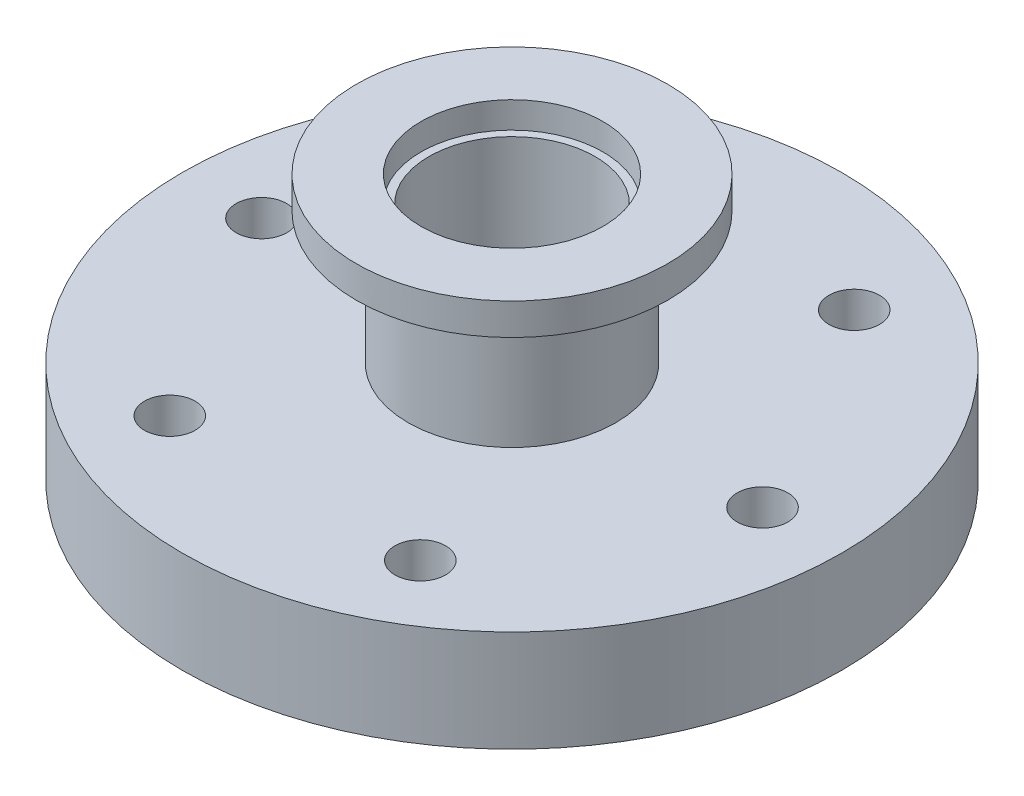
ISO-10303-21;
HEADER;
FILE_DESCRIPTION(('STEP AP214'),'2;1');
FILE_NAME('part.step','',(''),(''),'','','');
FILE_SCHEMA(('AUTOMOTIVE_DESIGN { 1 0 10303 214 1 1 1 1 }'));
ENDSEC;
DATA;
#1=APPLICATION_CONTEXT('core data for automotive mechanical design processes');
#2=APPLICATION_PROTOCOL_DEFINITION('international standard','automotive_design',2000,#1);
#3=PRODUCT_CONTEXT('',#1,'mechanical');
#4=PRODUCT('Part','Part','',(#3));
#5=PRODUCT_RELATED_PRODUCT_CATEGORY('part','',(#4));
#6=PRODUCT_DEFINITION_FORMATION('','',#4);
#7=PRODUCT_DEFINITION_CONTEXT('part definition',#1,'design');
#8=PRODUCT_DEFINITION('design','',#6,#7);
#9=PRODUCT_DEFINITION_SHAPE('','',#8);
#10=(LENGTH_UNIT() NAMED_UNIT(*) SI_UNIT(.MILLI.,.METRE.));
#11=(NAMED_UNIT(*) PLANE_ANGLE_UNIT() SI_UNIT($,.RADIAN.));
#12=(NAMED_UNIT(*) SI_UNIT($,.STERADIAN.) SOLID_ANGLE_UNIT());
#13=UNCERTAINTY_MEASURE_WITH_UNIT(LENGTH_MEASURE(1.E-05),#10,'distance_accuracy_value','');
#14=(GEOMETRIC_REPRESENTATION_CONTEXT(3) GLOBAL_UNCERTAINTY_ASSIGNED_CONTEXT((#13)) GLOBAL_UNIT_ASSIGNED_CONTEXT((#10,
#11,#12)) REPRESENTATION_CONTEXT('',''));
#15=CARTESIAN_POINT('',(0.,0.,0.));
#16=DIRECTION('',(0.,0.,1.));
#17=DIRECTION('',(1.,0.,0.));
#18=AXIS2_PLACEMENT_3D('',#15,#16,#17);
#19=CARTESIAN_POINT('',(0.,22.479,0.));
#20=DIRECTION('',(0.,-1.,0.));
#21=DIRECTION('',(0.,0.,-1.));
#22=AXIS2_PLACEMENT_3D('',#19,#20,#21);
#23=CYLINDRICAL_SURFACE('',#22,10.);
#24=CARTESIAN_POINT('',(0.,9.779,0.));
#25=DIRECTION('',(0.,1.,0.));
#26=DIRECTION('',(0.,0.,1.));
#27=AXIS2_PLACEMENT_3D('',#24,#25,#26);
#28=CIRCLE('',#27,10.);
#29=CARTESIAN_POINT('',(0.,9.779,10.));
#30=VERTEX_POINT('',#29);
#31=EDGE_CURVE('E122',#30,#30,#28,.T.);
#32=ORIENTED_EDGE('',*,*,#31,.T.);
#33=EDGE_LOOP('',(#32));
#34=FACE_BOUND('',#33,.T.);
#35=CARTESIAN_POINT('',(0.,21.1430053265385,0.));
#36=DIRECTION('',(0.,1.,0.));
#37=DIRECTION('',(0.,0.,1.));
#38=AXIS2_PLACEMENT_3D('',#35,#36,#37);
#39=CIRCLE('',#38,10.);
#40=CARTESIAN_POINT('',(0.,21.1430053265385,10.));
#41=VERTEX_POINT('',#40);
#42=EDGE_CURVE('E10',#41,#41,#39,.T.);
#43=ORIENTED_EDGE('',*,*,#42,.F.);
#44=EDGE_LOOP('',(#43));
#45=FACE_BOUND('',#44,.T.);
#46=ADVANCED_FACE('F41',(#34,#45),#23,.T.);
#47=CARTESIAN_POINT('',(0.,9.779,0.));
#48=DIRECTION('',(0.,-1.,0.));
#49=DIRECTION('',(0.,0.,-1.));
#50=AXIS2_PLACEMENT_3D('',#47,#48,#49);
#51=CYLINDRICAL_SURFACE('',#50,31.75);
#52=CARTESIAN_POINT('',(0.,9.779,0.));
#53=DIRECTION('',(0.,1.,0.));
#54=DIRECTION('',(0.,0.,1.));
#55=AXIS2_PLACEMENT_3D('',#52,#53,#54);
#56=CIRCLE('',#55,31.75);
#57=CARTESIAN_POINT('',(0.,9.779,31.75));
#58=VERTEX_POINT('',#57);
#59=EDGE_CURVE('E49',#58,#58,#56,.T.);
#60=ORIENTED_EDGE('',*,*,#59,.F.);
#61=EDGE_LOOP('',(#60));
#62=FACE_BOUND('',#61,.T.);
#63=CARTESIAN_POINT('',(0.,0.,0.));
#64=DIRECTION('',(0.,1.,0.));
#65=DIRECTION('',(0.,0.,1.));
#66=AXIS2_PLACEMENT_3D('',#63,#64,#65);
#67=CIRCLE('',#66,31.75);
#68=CARTESIAN_POINT('',(0.,0.,31.75));
#69=VERTEX_POINT('',#68);
#70=EDGE_CURVE('E54',#69,#69,#67,.T.);
#71=ORIENTED_EDGE('',*,*,#70,.T.);
#72=EDGE_LOOP('',(#71));
#73=FACE_BOUND('',#72,.T.);
#74=ADVANCED_FACE('F43',(#62,#73),#51,.T.);
#75=CARTESIAN_POINT('',(0.,9.779,0.));
#76=DIRECTION('',(0.,1.,0.));
#77=DIRECTION('',(0.,0.,1.));
#78=AXIS2_PLACEMENT_3D('',#75,#76,#77);
#79=PLANE('',#78);
#80=ORIENTED_EDGE('',*,*,#31,.F.);
#81=EDGE_LOOP('',(#80));
#82=FACE_BOUND('',#81,.T.);
#83=CARTESIAN_POINT('',(-12.0625000000002,9.779,20.8928628662994));
#84=DIRECTION('',(0.,1.,0.));
#85=DIRECTION('',(0.866025403784433,0.,0.50000000000001));
#86=AXIS2_PLACEMENT_3D('',#83,#84,#85);
#87=CIRCLE('',#86,2.4384);
#88=CARTESIAN_POINT('',(-9.95078365541228,9.779,22.1120628662995));
#89=VERTEX_POINT('',#88);
#90=EDGE_CURVE('E78',#89,#89,#87,.T.);
#91=ORIENTED_EDGE('',*,*,#90,.F.);
#92=EDGE_LOOP('',(#91));
#93=FACE_BOUND('',#92,.T.);
#94=CARTESIAN_POINT('',(12.0624999999998,9.779,20.8928628662997));
#95=DIRECTION('',(0.,1.,0.));
#96=DIRECTION('',(0.866025403784443,0.,-0.499999999999992));
#97=AXIS2_PLACEMENT_3D('',#94,#95,#96);
#98=CIRCLE('',#97,2.4384);
#99=CARTESIAN_POINT('',(14.1742163445878,9.779,19.6736628662997));
#100=VERTEX_POINT('',#99);
#101=EDGE_CURVE('E87',#100,#100,#98,.T.);
#102=ORIENTED_EDGE('',*,*,#101,.F.);
#103=EDGE_LOOP('',(#102));
#104=FACE_BOUND('',#103,.T.);
#105=CARTESIAN_POINT('',(24.125,9.779,0.));
#106=DIRECTION('',(0.,1.,0.));
#107=DIRECTION('',(0.,0.,-1.));
#108=AXIS2_PLACEMENT_3D('',#105,#106,#107);
#109=CIRCLE('',#108,2.4384);
#110=CARTESIAN_POINT('',(24.125,9.779,-2.4384));
#111=VERTEX_POINT('',#110);
#112=EDGE_CURVE('E95',#111,#111,#109,.T.);
#113=ORIENTED_EDGE('',*,*,#112,.F.);
#114=EDGE_LOOP('',(#113));
#115=FACE_BOUND('',#114,.T.);
#116=CARTESIAN_POINT('',(12.0625000000001,9.779,-20.8928628662995));
#117=DIRECTION('',(0.,1.,0.));
#118=DIRECTION('',(-0.866025403784436,0.,-0.500000000000004));
#119=AXIS2_PLACEMENT_3D('',#116,#117,#118);
#120=CIRCLE('',#119,2.4384);
#121=CARTESIAN_POINT('',(9.95078365541213,9.779,-22.1120628662995));
#122=VERTEX_POINT('',#121);
#123=EDGE_CURVE('E103',#122,#122,#120,.T.);
#124=ORIENTED_EDGE('',*,*,#123,.F.);
#125=EDGE_LOOP('',(#124));
#126=FACE_BOUND('',#125,.T.);
#127=CARTESIAN_POINT('',(-12.0625,9.779,-20.8928628662996));
#128=DIRECTION('',(0.,1.,0.));
#129=DIRECTION('',(-0.86602540378444,0.,0.499999999999998));
#130=AXIS2_PLACEMENT_3D('',#127,#128,#129);
#131=CIRCLE('',#130,2.4384);
#132=CARTESIAN_POINT('',(-14.1742163445879,9.779,-19.6736628662996));
#133=VERTEX_POINT('',#132);
#134=EDGE_CURVE('E70',#133,#133,#131,.T.);
#135=ORIENTED_EDGE('',*,*,#134,.F.);
#136=EDGE_LOOP('',(#135));
#137=FACE_BOUND('',#136,.T.);
#138=CARTESIAN_POINT('',(-24.125,9.779,0.));
#139=DIRECTION('',(0.,1.,0.));
#140=DIRECTION('',(0.,0.,1.));
#141=AXIS2_PLACEMENT_3D('',#138,#139,#140);
#142=CIRCLE('',#141,2.4384);
#143=CARTESIAN_POINT('',(-24.125,9.779,2.4384));
#144=VERTEX_POINT('',#143);
#145=EDGE_CURVE('E62',#144,#144,#142,.T.);
#146=ORIENTED_EDGE('',*,*,#145,.F.);
#147=EDGE_LOOP('',(#146));
#148=FACE_BOUND('',#147,.T.);
#149=ORIENTED_EDGE('',*,*,#59,.T.);
#150=EDGE_LOOP('',(#149));
#151=FACE_BOUND('',#150,.T.);
#152=ADVANCED_FACE('F174',(#82,#93,#104,#115,#126,#137,#148,#151),#79,.T.);
#153=CARTESIAN_POINT('',(0.,0.,0.));
#154=DIRECTION('',(0.,1.,0.));
#155=DIRECTION('',(0.,0.,1.));
#156=AXIS2_PLACEMENT_3D('',#153,#154,#155);
#157=PLANE('',#156);
#158=CARTESIAN_POINT('',(0.,0.,0.));
#159=DIRECTION('',(0.,-1.,0.));
#160=DIRECTION('',(0.,0.,-1.));
#161=AXIS2_PLACEMENT_3D('',#158,#159,#160);
#162=CIRCLE('',#161,20.955);
#163=CARTESIAN_POINT('',(0.,0.,-20.955));
#164=VERTEX_POINT('',#163);
#165=EDGE_CURVE('E110',#164,#164,#162,.T.);
#166=ORIENTED_EDGE('',*,*,#165,.F.);
#167=EDGE_LOOP('',(#166));
#168=FACE_BOUND('',#167,.T.);
#169=CARTESIAN_POINT('',(-12.0625000000002,0.,20.8928628662994));
#170=DIRECTION('',(0.,1.,0.));
#171=DIRECTION('',(0.866025403784433,0.,0.50000000000001));
#172=AXIS2_PLACEMENT_3D('',#169,#170,#171);
#173=CIRCLE('',#172,2.4384);
#174=CARTESIAN_POINT('',(-9.95078365541228,0.,22.1120628662995));
#175=VERTEX_POINT('',#174);
#176=EDGE_CURVE('E82',#175,#175,#173,.T.);
#177=ORIENTED_EDGE('',*,*,#176,.T.);
#178=EDGE_LOOP('',(#177));
#179=FACE_BOUND('',#178,.T.);
#180=CARTESIAN_POINT('',(12.0624999999998,0.,20.8928628662997));
#181=DIRECTION('',(0.,1.,0.));
#182=DIRECTION('',(0.866025403784443,0.,-0.499999999999992));
#183=AXIS2_PLACEMENT_3D('',#180,#181,#182);
#184=CIRCLE('',#183,2.4384);
#185=CARTESIAN_POINT('',(14.1742163445878,0.,19.6736628662997));
#186=VERTEX_POINT('',#185);
#187=EDGE_CURVE('E91',#186,#186,#184,.T.);
#188=ORIENTED_EDGE('',*,*,#187,.T.);
#189=EDGE_LOOP('',(#188));
#190=FACE_BOUND('',#189,.T.);
#191=CARTESIAN_POINT('',(24.125,0.,0.));
#192=DIRECTION('',(0.,1.,0.));
#193=DIRECTION('',(0.,0.,-1.));
#194=AXIS2_PLACEMENT_3D('',#191,#192,#193);
#195=CIRCLE('',#194,2.4384);
#196=CARTESIAN_POINT('',(24.125,0.,-2.4384));
#197=VERTEX_POINT('',#196);
#198=EDGE_CURVE('E99',#197,#197,#195,.T.);
#199=ORIENTED_EDGE('',*,*,#198,.T.);
#200=EDGE_LOOP('',(#199));
#201=FACE_BOUND('',#200,.T.);
#202=CARTESIAN_POINT('',(12.0625000000001,0.,-20.8928628662995));
#203=DIRECTION('',(0.,1.,0.));
#204=DIRECTION('',(-0.866025403784436,0.,-0.500000000000004));
#205=AXIS2_PLACEMENT_3D('',#202,#203,#204);
#206=CIRCLE('',#205,2.4384);
#207=CARTESIAN_POINT('',(9.95078365541213,0.,-22.1120628662995));
#208=VERTEX_POINT('',#207);
#209=EDGE_CURVE('E74',#208,#208,#206,.T.);
#210=ORIENTED_EDGE('',*,*,#209,.T.);
#211=EDGE_LOOP('',(#210));
#212=FACE_BOUND('',#211,.T.);
#213=CARTESIAN_POINT('',(-12.0625,0.,-20.8928628662996));
#214=DIRECTION('',(0.,1.,0.));
#215=DIRECTION('',(-0.86602540378444,0.,0.499999999999998));
#216=AXIS2_PLACEMENT_3D('',#213,#214,#215);
#217=CIRCLE('',#216,2.4384);
#218=CARTESIAN_POINT('',(-14.1742163445879,0.,-19.6736628662996));
#219=VERTEX_POINT('',#218);
#220=EDGE_CURVE('E66',#219,#219,#217,.T.);
#221=ORIENTED_EDGE('',*,*,#220,.T.);
#222=EDGE_LOOP('',(#221));
#223=FACE_BOUND('',#222,.T.);
#224=CARTESIAN_POINT('',(-24.125,0.,0.));
#225=DIRECTION('',(0.,1.,0.));
#226=DIRECTION('',(0.,0.,1.));
#227=AXIS2_PLACEMENT_3D('',#224,#225,#226);
#228=CIRCLE('',#227,2.4384);
#229=CARTESIAN_POINT('',(-24.125,0.,2.4384));
#230=VERTEX_POINT('',#229);
#231=EDGE_CURVE('E60',#230,#230,#228,.T.);
#232=ORIENTED_EDGE('',*,*,#231,.T.);
#233=EDGE_LOOP('',(#232));
#234=FACE_BOUND('',#233,.T.);
#235=ORIENTED_EDGE('',*,*,#70,.F.);
#236=EDGE_LOOP('',(#235));
#237=FACE_BOUND('',#236,.T.);
#238=ADVANCED_FACE('F213',(#168,#179,#190,#201,#212,#223,#234,#237),#157,.F.);
#239=CARTESIAN_POINT('',(-24.125,0.,0.));
#240=DIRECTION('',(0.,1.,0.));
#241=DIRECTION('',(0.,0.,1.));
#242=AXIS2_PLACEMENT_3D('',#239,#240,#241);
#243=CYLINDRICAL_SURFACE('',#242,2.4384);
#244=ORIENTED_EDGE('',*,*,#231,.F.);
#245=EDGE_LOOP('',(#244));
#246=FACE_BOUND('',#245,.T.);
#247=ORIENTED_EDGE('',*,*,#145,.T.);
#248=EDGE_LOOP('',(#247));
#249=FACE_BOUND('',#248,.T.);
#250=ADVANCED_FACE('F209',(#246,#249),#243,.F.);
#251=CARTESIAN_POINT('',(-12.0625,0.,-20.8928628662996));
#252=DIRECTION('',(0.,1.,0.));
#253=DIRECTION('',(0.,0.,1.));
#254=AXIS2_PLACEMENT_3D('',#251,#252,#253);
#255=CYLINDRICAL_SURFACE('',#254,2.4384);
#256=ORIENTED_EDGE('',*,*,#220,.F.);
#257=EDGE_LOOP('',(#256));
#258=FACE_BOUND('',#257,.T.);
#259=ORIENTED_EDGE('',*,*,#134,.T.);
#260=EDGE_LOOP('',(#259));
#261=FACE_BOUND('',#260,.T.);
#262=ADVANCED_FACE('F195',(#258,#261),#255,.F.);
#263=CARTESIAN_POINT('',(12.0625000000001,0.,-20.8928628662995));
#264=DIRECTION('',(0.,1.,0.));
#265=DIRECTION('',(0.,0.,1.));
#266=AXIS2_PLACEMENT_3D('',#263,#264,#265);
#267=CYLINDRICAL_SURFACE('',#266,2.4384);
#268=ORIENTED_EDGE('',*,*,#209,.F.);
#269=EDGE_LOOP('',(#268));
#270=FACE_BOUND('',#269,.T.);
#271=ORIENTED_EDGE('',*,*,#123,.T.);
#272=EDGE_LOOP('',(#271));
#273=FACE_BOUND('',#272,.T.);
#274=ADVANCED_FACE('F191',(#270,#273),#267,.F.);
#275=CARTESIAN_POINT('',(24.125,0.,0.));
#276=DIRECTION('',(0.,1.,0.));
#277=DIRECTION('',(0.,0.,1.));
#278=AXIS2_PLACEMENT_3D('',#275,#276,#277);
#279=CYLINDRICAL_SURFACE('',#278,2.4384);
#280=ORIENTED_EDGE('',*,*,#198,.F.);
#281=EDGE_LOOP('',(#280));
#282=FACE_BOUND('',#281,.T.);
#283=ORIENTED_EDGE('',*,*,#112,.T.);
#284=EDGE_LOOP('',(#283));
#285=FACE_BOUND('',#284,.T.);
#286=ADVANCED_FACE('F194',(#282,#285),#279,.F.);
#287=CARTESIAN_POINT('',(12.0624999999998,0.,20.8928628662997));
#288=DIRECTION('',(0.,1.,0.));
#289=DIRECTION('',(0.,0.,1.));
#290=AXIS2_PLACEMENT_3D('',#287,#288,#289);
#291=CYLINDRICAL_SURFACE('',#290,2.4384);
#292=ORIENTED_EDGE('',*,*,#187,.F.);
#293=EDGE_LOOP('',(#292));
#294=FACE_BOUND('',#293,.T.);
#295=ORIENTED_EDGE('',*,*,#101,.T.);
#296=EDGE_LOOP('',(#295));
#297=FACE_BOUND('',#296,.T.);
#298=ADVANCED_FACE('F199',(#294,#297),#291,.F.);
#299=CARTESIAN_POINT('',(-12.0625000000002,0.,20.8928628662994));
#300=DIRECTION('',(0.,1.,0.));
#301=DIRECTION('',(0.,0.,1.));
#302=AXIS2_PLACEMENT_3D('',#299,#300,#301);
#303=CYLINDRICAL_SURFACE('',#302,2.4384);
#304=ORIENTED_EDGE('',*,*,#176,.F.);
#305=EDGE_LOOP('',(#304));
#306=FACE_BOUND('',#305,.T.);
#307=ORIENTED_EDGE('',*,*,#90,.T.);
#308=EDGE_LOOP('',(#307));
#309=FACE_BOUND('',#308,.T.);
#310=ADVANCED_FACE('F189',(#306,#309),#303,.F.);
#311=CARTESIAN_POINT('',(0.,2.,0.));
#312=DIRECTION('',(0.,-1.,0.));
#313=DIRECTION('',(0.,0.,-1.));
#314=AXIS2_PLACEMENT_3D('',#311,#312,#313);
#315=CYLINDRICAL_SURFACE('',#314,20.955);
#316=CARTESIAN_POINT('',(0.,2.,0.));
#317=DIRECTION('',(0.,-1.,0.));
#318=DIRECTION('',(0.,0.,-1.));
#319=AXIS2_PLACEMENT_3D('',#316,#317,#318);
#320=CIRCLE('',#319,20.955);
#321=CARTESIAN_POINT('',(0.,2.,-20.955));
#322=VERTEX_POINT('',#321);
#323=EDGE_CURVE('E83',#322,#322,#320,.T.);
#324=ORIENTED_EDGE('',*,*,#323,.F.);
#325=EDGE_LOOP('',(#324));
#326=FACE_BOUND('',#325,.T.);
#327=ORIENTED_EDGE('',*,*,#165,.T.);
#328=EDGE_LOOP('',(#327));
#329=FACE_BOUND('',#328,.T.);
#330=ADVANCED_FACE('F185',(#326,#329),#315,.F.);
#331=CARTESIAN_POINT('',(0.,2.,0.));
#332=DIRECTION('',(0.,-1.,0.));
#333=DIRECTION('',(0.,0.,-1.));
#334=AXIS2_PLACEMENT_3D('',#331,#332,#333);
#335=PLANE('',#334);
#336=CARTESIAN_POINT('',(0.,2.,0.));
#337=DIRECTION('',(0.,-1.,0.));
#338=DIRECTION('',(0.,0.,-1.));
#339=AXIS2_PLACEMENT_3D('',#336,#337,#338);
#340=CIRCLE('',#339,17.8435);
#341=CARTESIAN_POINT('',(0.,2.,-17.8435));
#342=VERTEX_POINT('',#341);
#343=EDGE_CURVE('E114',#342,#342,#340,.T.);
#344=ORIENTED_EDGE('',*,*,#343,.F.);
#345=EDGE_LOOP('',(#344));
#346=FACE_BOUND('',#345,.T.);
#347=ORIENTED_EDGE('',*,*,#323,.T.);
#348=EDGE_LOOP('',(#347));
#349=FACE_BOUND('',#348,.T.);
#350=ADVANCED_FACE('F181',(#346,#349),#335,.T.);
#351=CARTESIAN_POINT('',(0.,2.,0.));
#352=DIRECTION('',(0.,-1.,0.));
#353=DIRECTION('',(0.,0.,-1.));
#354=AXIS2_PLACEMENT_3D('',#351,#352,#353);
#355=CYLINDRICAL_SURFACE('',#354,17.8435);
#356=ORIENTED_EDGE('',*,*,#343,.T.);
#357=EDGE_LOOP('',(#356));
#358=FACE_BOUND('',#357,.T.);
#359=CARTESIAN_POINT('',(0.,0.,0.));
#360=DIRECTION('',(0.,-1.,0.));
#361=DIRECTION('',(0.,0.,-1.));
#362=AXIS2_PLACEMENT_3D('',#359,#360,#361);
#363=CIRCLE('',#362,17.8435);
#364=CARTESIAN_POINT('',(0.,0.,-17.8435));
#365=VERTEX_POINT('',#364);
#366=EDGE_CURVE('E118',#365,#365,#363,.T.);
#367=ORIENTED_EDGE('',*,*,#366,.F.);
#368=EDGE_LOOP('',(#367));
#369=FACE_BOUND('',#368,.T.);
#370=ADVANCED_FACE('F178',(#358,#369),#355,.T.);
#371=CARTESIAN_POINT('',(0.,0.,0.));
#372=DIRECTION('',(0.,1.,0.));
#373=DIRECTION('',(0.,0.,1.));
#374=AXIS2_PLACEMENT_3D('',#371,#372,#373);
#375=CIRCLE('',#374,8.);
#376=CARTESIAN_POINT('',(0.,0.,8.));
#377=VERTEX_POINT('',#376);
#378=EDGE_CURVE('E145',#377,#377,#375,.T.);
#379=ORIENTED_EDGE('',*,*,#378,.T.);
#380=EDGE_LOOP('',(#379));
#381=FACE_BOUND('',#380,.T.);
#382=ORIENTED_EDGE('',*,*,#366,.T.);
#383=EDGE_LOOP('',(#382));
#384=FACE_BOUND('',#383,.T.);
#385=ADVANCED_FACE('F154',(#381,#384),#157,.F.);
#386=CARTESIAN_POINT('',(0.,22.479,0.));
#387=DIRECTION('',(0.,1.,0.));
#388=DIRECTION('',(0.,0.,1.));
#389=AXIS2_PLACEMENT_3D('',#386,#387,#388);
#390=CONICAL_SURFACE('',#389,14.986,1.30899693899575);
#391=ORIENTED_EDGE('',*,*,#42,.T.);
#392=EDGE_LOOP('',(#391));
#393=FACE_BOUND('',#392,.T.);
#394=CARTESIAN_POINT('',(0.,22.479,0.));
#395=DIRECTION('',(0.,-1.,0.));
#396=DIRECTION('',(0.,0.,-1.));
#397=AXIS2_PLACEMENT_3D('',#394,#395,#396);
#398=CIRCLE('',#397,14.986);
#399=CARTESIAN_POINT('',(0.,22.479,-14.986));
#400=VERTEX_POINT('',#399);
#401=EDGE_CURVE('E138',#400,#400,#398,.T.);
#402=ORIENTED_EDGE('',*,*,#401,.T.);
#403=EDGE_LOOP('',(#402));
#404=FACE_BOUND('',#403,.T.);
#405=ADVANCED_FACE('F224',(#393,#404),#390,.T.);
#406=CARTESIAN_POINT('',(0.,22.987,0.));
#407=DIRECTION('',(0.,1.,0.));
#408=DIRECTION('',(0.,0.,1.));
#409=AXIS2_PLACEMENT_3D('',#406,#407,#408);
#410=PLANE('',#409);
#411=CARTESIAN_POINT('',(0.,22.987,0.));
#412=DIRECTION('',(0.,1.,0.));
#413=DIRECTION('',(0.,0.,1.));
#414=AXIS2_PLACEMENT_3D('',#411,#412,#413);
#415=CIRCLE('',#414,8.);
#416=CARTESIAN_POINT('',(0.,22.987,8.));
#417=VERTEX_POINT('',#416);
#418=EDGE_CURVE('E146',#417,#417,#415,.T.);
#419=ORIENTED_EDGE('',*,*,#418,.F.);
#420=EDGE_LOOP('',(#419));
#421=FACE_BOUND('',#420,.T.);
#422=CARTESIAN_POINT('',(0.,22.987,0.));
#423=DIRECTION('',(0.,1.,0.));
#424=DIRECTION('',(0.,0.,1.));
#425=AXIS2_PLACEMENT_3D('',#422,#423,#424);
#426=CIRCLE('',#425,8.763);
#427=CARTESIAN_POINT('',(0.,22.987,8.763));
#428=VERTEX_POINT('',#427);
#429=EDGE_CURVE('E133',#428,#428,#426,.T.);
#430=ORIENTED_EDGE('',*,*,#429,.T.);
#431=EDGE_LOOP('',(#430));
#432=FACE_BOUND('',#431,.T.);
#433=ADVANCED_FACE('F228',(#421,#432),#410,.T.);
#434=CARTESIAN_POINT('',(0.,22.987,0.));
#435=DIRECTION('',(0.,1.,0.));
#436=DIRECTION('',(0.,0.,1.));
#437=AXIS2_PLACEMENT_3D('',#434,#435,#436);
#438=CYLINDRICAL_SURFACE('',#437,8.763);
#439=ORIENTED_EDGE('',*,*,#429,.F.);
#440=EDGE_LOOP('',(#439));
#441=FACE_BOUND('',#440,.T.);
#442=CARTESIAN_POINT('',(0.,25.527,0.));
#443=DIRECTION('',(0.,1.,0.));
#444=DIRECTION('',(0.,0.,1.));
#445=AXIS2_PLACEMENT_3D('',#442,#443,#444);
#446=CIRCLE('',#445,8.763);
#447=CARTESIAN_POINT('',(0.,25.527,8.763));
#448=VERTEX_POINT('',#447);
#449=EDGE_CURVE('E134',#448,#448,#446,.T.);
#450=ORIENTED_EDGE('',*,*,#449,.T.);
#451=EDGE_LOOP('',(#450));
#452=FACE_BOUND('',#451,.T.);
#453=ADVANCED_FACE('F233',(#441,#452),#438,.F.);
#454=CARTESIAN_POINT('',(0.,25.527,0.));
#455=DIRECTION('',(0.,1.,0.));
#456=DIRECTION('',(0.,0.,1.));
#457=AXIS2_PLACEMENT_3D('',#454,#455,#456);
#458=PLANE('',#457);
#459=ORIENTED_EDGE('',*,*,#449,.F.);
#460=EDGE_LOOP('',(#459));
#461=FACE_BOUND('',#460,.T.);
#462=CARTESIAN_POINT('',(0.,25.527,0.));
#463=DIRECTION('',(0.,1.,0.));
#464=DIRECTION('',(0.,0.,1.));
#465=AXIS2_PLACEMENT_3D('',#462,#463,#464);
#466=CIRCLE('',#465,14.986);
#467=CARTESIAN_POINT('',(0.,25.527,-14.986));
#468=VERTEX_POINT('',#467);
#469=EDGE_CURVE('E129',#468,#468,#466,.T.);
#470=ORIENTED_EDGE('',*,*,#469,.T.);
#471=EDGE_LOOP('',(#470));
#472=FACE_BOUND('',#471,.T.);
#473=ADVANCED_FACE('F165',(#461,#472),#458,.T.);
#474=CARTESIAN_POINT('',(0.,25.527,0.));
#475=DIRECTION('',(0.,-1.,0.));
#476=DIRECTION('',(0.,0.,-1.));
#477=AXIS2_PLACEMENT_3D('',#474,#475,#476);
#478=CYLINDRICAL_SURFACE('',#477,14.986);
#479=CARTESIAN_POINT('',(0.,25.527,-14.986));
#480=CARTESIAN_POINT('',(0.,25.49525,-14.986));
#481=CARTESIAN_POINT('',(0.,25.4635,-14.986));
#482=CARTESIAN_POINT('',(0.,25.4,-14.986));
#483=CARTESIAN_POINT('',(0.,25.36825,-14.986));
#484=CARTESIAN_POINT('',(0.,25.30475,-14.986));
#485=CARTESIAN_POINT('',(0.,25.273,-14.986));
#486=CARTESIAN_POINT('',(0.,25.2095,-14.986));
#487=CARTESIAN_POINT('',(0.,25.17775,-14.986));
#488=CARTESIAN_POINT('',(0.,25.11425,-14.986));
#489=CARTESIAN_POINT('',(0.,25.0825,-14.986));
#490=CARTESIAN_POINT('',(0.,25.019,-14.986));
#491=CARTESIAN_POINT('',(0.,24.98725,-14.986));
#492=CARTESIAN_POINT('',(0.,24.92375,-14.986));
#493=CARTESIAN_POINT('',(0.,24.892,-14.986));
#494=CARTESIAN_POINT('',(0.,24.8285,-14.986));
#495=CARTESIAN_POINT('',(0.,24.79675,-14.986));
#496=CARTESIAN_POINT('',(0.,24.73325,-14.986));
#497=CARTESIAN_POINT('',(0.,24.7015,-14.986));
#498=CARTESIAN_POINT('',(0.,24.638,-14.986));
#499=CARTESIAN_POINT('',(0.,24.60625,-14.986));
#500=CARTESIAN_POINT('',(0.,24.54275,-14.986));
#501=CARTESIAN_POINT('',(0.,24.511,-14.986));
#502=CARTESIAN_POINT('',(0.,24.4475,-14.986));
#503=CARTESIAN_POINT('',(0.,24.41575,-14.986));
#504=CARTESIAN_POINT('',(0.,24.35225,-14.986));
#505=CARTESIAN_POINT('',(0.,24.3205,-14.986));
#506=CARTESIAN_POINT('',(0.,24.257,-14.986));
#507=CARTESIAN_POINT('',(0.,24.22525,-14.986));
#508=CARTESIAN_POINT('',(0.,24.16175,-14.986));
#509=CARTESIAN_POINT('',(0.,24.13,-14.986));
#510=CARTESIAN_POINT('',(0.,24.0665,-14.986));
#511=CARTESIAN_POINT('',(0.,24.03475,-14.986));
#512=CARTESIAN_POINT('',(0.,23.97125,-14.986));
#513=CARTESIAN_POINT('',(0.,23.9395,-14.986));
#514=CARTESIAN_POINT('',(0.,23.876,-14.986));
#515=CARTESIAN_POINT('',(0.,23.84425,-14.986));
#516=CARTESIAN_POINT('',(0.,23.78075,-14.986));
#517=CARTESIAN_POINT('',(0.,23.749,-14.986));
#518=CARTESIAN_POINT('',(0.,23.6855,-14.986));
#519=CARTESIAN_POINT('',(0.,23.65375,-14.986));
#520=CARTESIAN_POINT('',(0.,23.59025,-14.986));
#521=CARTESIAN_POINT('',(0.,23.5585,-14.986));
#522=CARTESIAN_POINT('',(0.,23.495,-14.986));
#523=CARTESIAN_POINT('',(0.,23.46325,-14.986));
#524=CARTESIAN_POINT('',(0.,23.39975,-14.986));
#525=CARTESIAN_POINT('',(0.,23.368,-14.986));
#526=CARTESIAN_POINT('',(0.,23.3045,-14.986));
#527=CARTESIAN_POINT('',(0.,23.27275,-14.986));
#528=CARTESIAN_POINT('',(0.,23.20925,-14.986));
#529=CARTESIAN_POINT('',(0.,23.1775,-14.986));
#530=CARTESIAN_POINT('',(0.,23.114,-14.986));
#531=CARTESIAN_POINT('',(0.,23.08225,-14.986));
#532=CARTESIAN_POINT('',(0.,23.01875,-14.986));
#533=CARTESIAN_POINT('',(0.,22.987,-14.986));
#534=CARTESIAN_POINT('',(0.,22.9235,-14.986));
#535=CARTESIAN_POINT('',(0.,22.89175,-14.986));
#536=CARTESIAN_POINT('',(0.,22.82825,-14.986));
#537=CARTESIAN_POINT('',(0.,22.7965,-14.986));
#538=CARTESIAN_POINT('',(0.,22.733,-14.986));
#539=CARTESIAN_POINT('',(0.,22.70125,-14.986));
#540=CARTESIAN_POINT('',(0.,22.63775,-14.986));
#541=CARTESIAN_POINT('',(0.,22.606,-14.986));
#542=CARTESIAN_POINT('',(0.,22.5425,-14.986));
#543=CARTESIAN_POINT('',(0.,22.51075,-14.986));
#544=CARTESIAN_POINT('',(0.,22.479,-14.986));
#545=B_SPLINE_CURVE_WITH_KNOTS('',3,(#479,#480,#481,#482,#483,#484,#485,#486,#487,#488,#489,
#490,#491,#492,#493,#494,#495,#496,#497,#498,#499,#500,#501,#502,#503,#504,#505,#506,#507,#508,
#509,#510,#511,#512,#513,#514,#515,#516,#517,#518,#519,#520,#521,#522,#523,#524,#525,#526,#527,
#528,#529,#530,#531,#532,#533,#534,#535,#536,#537,#538,#539,#540,#541,#542,#543,#544),
.UNSPECIFIED.,.F.,.F.,(4,2,2,2,2,2,2,2,2,2,2,2,2,2,2,2,2,2,2,2,2,2,2,2,2,2,2,2,2,2,2,2,4),(0.,
0.0952500000000016,0.1905,0.285750000000001,0.380999999999999,0.476250000000001,
0.571499999999999,0.666750000000001,0.761999999999999,0.85725,0.952499999999998,1.04775,1.143,
1.23825,1.3335,1.42875,1.524,1.61925,1.7145,1.80975,1.905,2.00025,2.0955,2.19075,2.286,2.38125,
2.4765,2.57175,2.667,2.76225,2.8575,2.95275,3.048),.UNSPECIFIED.);
#546=EDGE_CURVE('BSEAM159',#468,#400,#545,.T.);
#547=ORIENTED_EDGE('',*,*,#469,.F.);
#548=ORIENTED_EDGE('',*,*,#401,.F.);
#549=ORIENTED_EDGE('',*,*,#546,.T.);
#550=ORIENTED_EDGE('',*,*,#546,.F.);
#551=EDGE_LOOP('',(#547,#549,#548,#550));
#552=FACE_BOUND('',#551,.T.);
#553=ADVANCED_FACE('F159',(#552),#478,.T.);
#554=CARTESIAN_POINT('',(0.,22.479,0.));
#555=DIRECTION('',(0.,-1.,0.));
#556=DIRECTION('',(0.,0.,-1.));
#557=AXIS2_PLACEMENT_3D('',#554,#555,#556);
#558=CYLINDRICAL_SURFACE('',#557,8.);
#559=ORIENTED_EDGE('',*,*,#418,.T.);
#560=EDGE_LOOP('',(#559));
#561=FACE_BOUND('',#560,.T.);
#562=ORIENTED_EDGE('',*,*,#378,.F.);
#563=EDGE_LOOP('',(#562));
#564=FACE_BOUND('',#563,.T.);
#565=ADVANCED_FACE('F157',(#561,#564),#558,.F.);
#566=CLOSED_SHELL('',(#46,#74,#152,#238,#250,#262,#274,#286,#298,#310,#330,#350,#370,#385,#405,
#433,#453,#473,#553,#565));
#567=MANIFOLD_SOLID_BREP('B2',#566);
#568=ADVANCED_BREP_SHAPE_REPRESENTATION('',(#18,#567),#14);
#569=SHAPE_DEFINITION_REPRESENTATION(#9,#568);
ENDSEC;
END-ISO-10303-21;
